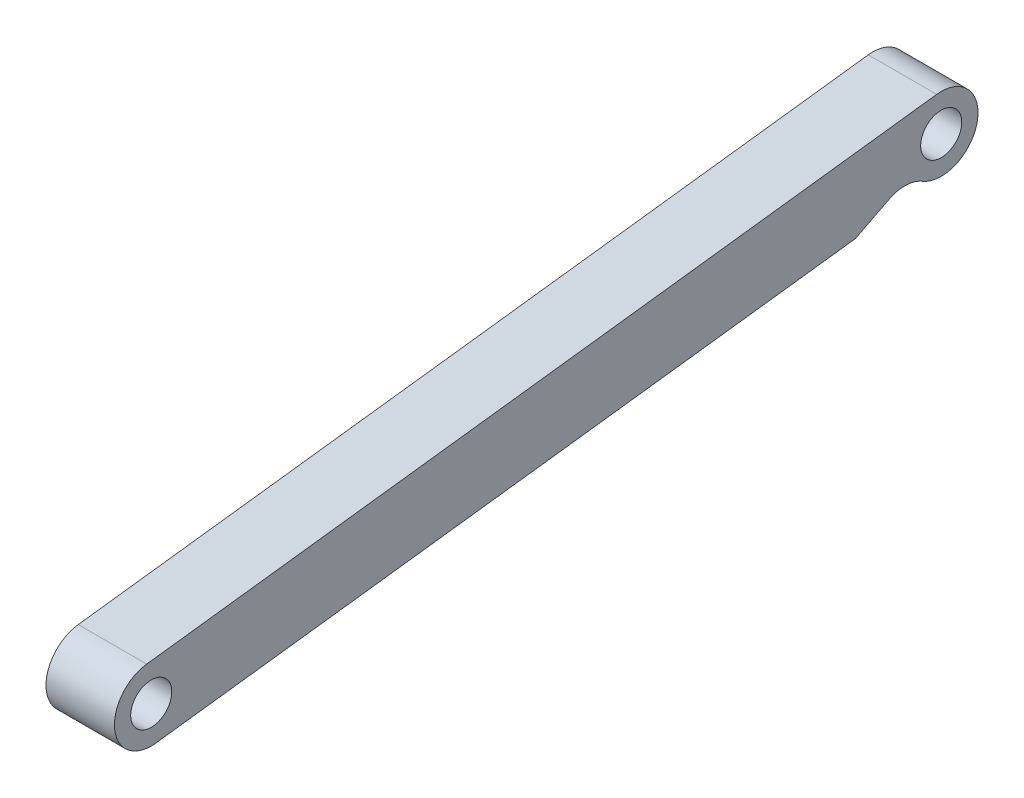
ISO-10303-21;
HEADER;
FILE_DESCRIPTION(('STEP AP214'),'2;1');
FILE_NAME('part.step','',(''),(''),'','','');
FILE_SCHEMA(('AUTOMOTIVE_DESIGN { 1 0 10303 214 1 1 1 1 }'));
ENDSEC;
DATA;
#1=APPLICATION_CONTEXT('core data for automotive mechanical design processes');
#2=APPLICATION_PROTOCOL_DEFINITION('international standard','automotive_design',2000,#1);
#3=PRODUCT_CONTEXT('',#1,'mechanical');
#4=PRODUCT('Part','Part','',(#3));
#5=PRODUCT_RELATED_PRODUCT_CATEGORY('part','',(#4));
#6=PRODUCT_DEFINITION_FORMATION('','',#4);
#7=PRODUCT_DEFINITION_CONTEXT('part definition',#1,'design');
#8=PRODUCT_DEFINITION('design','',#6,#7);
#9=PRODUCT_DEFINITION_SHAPE('','',#8);
#10=(LENGTH_UNIT() NAMED_UNIT(*) SI_UNIT(.MILLI.,.METRE.));
#11=(NAMED_UNIT(*) PLANE_ANGLE_UNIT() SI_UNIT($,.RADIAN.));
#12=(NAMED_UNIT(*) SI_UNIT($,.STERADIAN.) SOLID_ANGLE_UNIT());
#13=UNCERTAINTY_MEASURE_WITH_UNIT(LENGTH_MEASURE(1.E-05),#10,'distance_accuracy_value','');
#14=(GEOMETRIC_REPRESENTATION_CONTEXT(3) GLOBAL_UNCERTAINTY_ASSIGNED_CONTEXT((#13)) GLOBAL_UNIT_ASSIGNED_CONTEXT((#10,
#11,#12)) REPRESENTATION_CONTEXT('',''));
#15=CARTESIAN_POINT('',(0.,0.,0.));
#16=DIRECTION('',(0.,0.,1.));
#17=DIRECTION('',(1.,0.,0.));
#18=AXIS2_PLACEMENT_3D('',#15,#16,#17);
#19=CARTESIAN_POINT('',(-2.,-1.8147324714185,-44.0457999913151));
#20=DIRECTION('',(1.,0.,0.));
#21=DIRECTION('',(0.,0.,-1.));
#22=AXIS2_PLACEMENT_3D('',#19,#20,#21);
#23=CYLINDRICAL_SURFACE('',#22,2.);
#24=DIRECTION('',(1.,0.,0.));
#25=VECTOR('',#24,1.);
#26=CARTESIAN_POINT('',(-2.,-0.0967891116987391,-45.0698461879268));
#27=LINE('',#26,#25);
#28=CARTESIAN_POINT('',(-2.,-0.0967891116987391,-45.0698461879268));
#29=VERTEX_POINT('',#28);
#30=CARTESIAN_POINT('',(2.,-0.0967891116987391,-45.0698461879268));
#31=VERTEX_POINT('',#30);
#32=EDGE_CURVE('E42',#29,#31,#27,.T.);
#33=ORIENTED_EDGE('',*,*,#32,.T.);
#34=CARTESIAN_POINT('',(2.,-1.8147324714185,-44.0457999913151));
#35=DIRECTION('',(1.,0.,0.));
#36=DIRECTION('',(0.,0.,-1.));
#37=AXIS2_PLACEMENT_3D('',#34,#35,#36);
#38=CIRCLE('',#37,2.);
#39=CARTESIAN_POINT('',(2.,-0.0342900701942664,-43.1347429920429));
#40=VERTEX_POINT('',#39);
#41=EDGE_CURVE('E95',#31,#40,#38,.T.);
#42=ORIENTED_EDGE('',*,*,#41,.T.);
#43=DIRECTION('',(1.,0.,0.));
#44=VECTOR('',#43,1.);
#45=CARTESIAN_POINT('',(-2.,-0.0342900701942664,-43.1347429920429));
#46=LINE('',#45,#44);
#47=CARTESIAN_POINT('',(-2.,-0.0342900701942664,-43.1347429920429));
#48=VERTEX_POINT('',#47);
#49=EDGE_CURVE('E11',#48,#40,#46,.T.);
#50=ORIENTED_EDGE('',*,*,#49,.F.);
#51=CARTESIAN_POINT('',(-2.,-1.8147324714185,-44.0457999913151));
#52=DIRECTION('',(1.,0.,0.));
#53=DIRECTION('',(0.,0.,-1.));
#54=AXIS2_PLACEMENT_3D('',#51,#52,#53);
#55=CIRCLE('',#54,2.);
#56=EDGE_CURVE('E55',#29,#48,#55,.T.);
#57=ORIENTED_EDGE('',*,*,#56,.F.);
#58=EDGE_LOOP('',(#33,#42,#50,#57));
#59=FACE_BOUND('',#58,.T.);
#60=ADVANCED_FACE('F39',(#59),#23,.F.);
#61=CARTESIAN_POINT('',(-2.,-17.5192242955964,-8.96463255724983));
#62=DIRECTION('',(0.,-0.890221200612117,-0.455528499636106));
#63=DIRECTION('',(0.,0.455528499636106,-0.890221200612117));
#64=AXIS2_PLACEMENT_3D('',#61,#62,#63);
#65=PLANE('',#64);
#66=ORIENTED_EDGE('',*,*,#49,.T.);
#67=DIRECTION('',(0.,0.455528499636106,-0.890221200612117));
#68=VECTOR('',#67,1.);
#69=CARTESIAN_POINT('',(2.,-17.5192242955964,-8.96463255724983));
#70=LINE('',#69,#68);
#71=CARTESIAN_POINT('',(2.,-1.03929809240293,-41.1706958492843));
#72=VERTEX_POINT('',#71);
#73=EDGE_CURVE('E113',#72,#40,#70,.T.);
#74=ORIENTED_EDGE('',*,*,#73,.F.);
#75=DIRECTION('',(1.,0.,0.));
#76=VECTOR('',#75,1.);
#77=CARTESIAN_POINT('',(-2.,-1.03929809240293,-41.1706958492843));
#78=LINE('',#77,#76);
#79=CARTESIAN_POINT('',(-2.,-1.03929809240293,-41.1706958492843));
#80=VERTEX_POINT('',#79);
#81=EDGE_CURVE('E47',#80,#72,#78,.T.);
#82=ORIENTED_EDGE('',*,*,#81,.F.);
#83=DIRECTION('',(0.,0.455528499636106,-0.890221200612117));
#84=VECTOR('',#83,1.);
#85=CARTESIAN_POINT('',(-2.,-17.5192242955964,-8.96463255724983));
#86=LINE('',#85,#84);
#87=EDGE_CURVE('E139',#80,#48,#86,.T.);
#88=ORIENTED_EDGE('',*,*,#87,.T.);
#89=EDGE_LOOP('',(#66,#74,#82,#88));
#90=FACE_BOUND('',#89,.T.);
#91=ADVANCED_FACE('F163',(#90),#65,.T.);
#92=CARTESIAN_POINT('',(-2.,-6.07242734752955,-0.756247152138949));
#93=DIRECTION('',(0.,-0.992334215816846,-0.123583187040819));
#94=DIRECTION('',(0.,0.123583187040819,-0.992334215816846));
#95=AXIS2_PLACEMENT_3D('',#92,#93,#94);
#96=PLANE('',#95);
#97=ORIENTED_EDGE('',*,*,#81,.T.);
#98=DIRECTION('',(0.,0.123583187040819,-0.992334215816846));
#99=VECTOR('',#98,1.);
#100=CARTESIAN_POINT('',(2.,-6.07242734752955,-0.756247152138949));
#101=LINE('',#100,#99);
#102=CARTESIAN_POINT('',(2.,-6.13351856400622,-0.265703852137712));
#103=VERTEX_POINT('',#102);
#104=EDGE_CURVE('E120',#103,#72,#101,.T.);
#105=ORIENTED_EDGE('',*,*,#104,.F.);
#106=DIRECTION('',(1.,0.,0.));
#107=VECTOR('',#106,1.);
#108=CARTESIAN_POINT('',(-2.,-6.13351856400622,-0.265703852137712));
#109=LINE('',#108,#107);
#110=CARTESIAN_POINT('',(-2.,-6.13351856400622,-0.265703852137712));
#111=VERTEX_POINT('',#110);
#112=EDGE_CURVE('E147',#111,#103,#109,.T.);
#113=ORIENTED_EDGE('',*,*,#112,.F.);
#114=DIRECTION('',(0.,0.123583187040819,-0.992334215816846));
#115=VECTOR('',#114,1.);
#116=CARTESIAN_POINT('',(-2.,-6.07242734752955,-0.756247152138949));
#117=LINE('',#116,#115);
#118=EDGE_CURVE('E137',#111,#80,#117,.T.);
#119=ORIENTED_EDGE('',*,*,#118,.T.);
#120=EDGE_LOOP('',(#97,#105,#113,#119));
#121=FACE_BOUND('',#120,.T.);
#122=ADVANCED_FACE('F159',(#121),#96,.T.);
#123=CARTESIAN_POINT('',(-2.,-4.,0.));
#124=DIRECTION('',(1.,0.,0.));
#125=DIRECTION('',(0.,0.,-1.));
#126=AXIS2_PLACEMENT_3D('',#123,#124,#125);
#127=CYLINDRICAL_SURFACE('',#126,2.15);
#128=ORIENTED_EDGE('',*,*,#112,.T.);
#129=CARTESIAN_POINT('',(2.,-4.,0.));
#130=DIRECTION('',(1.,0.,0.));
#131=DIRECTION('',(0.,0.,-1.));
#132=AXIS2_PLACEMENT_3D('',#129,#130,#131);
#133=CIRCLE('',#132,2.15);
#134=CARTESIAN_POINT('',(2.,-1.86648143599378,0.265703852137809));
#135=VERTEX_POINT('',#134);
#136=EDGE_CURVE('E117',#135,#103,#133,.T.);
#137=ORIENTED_EDGE('',*,*,#136,.F.);
#138=DIRECTION('',(1.,0.,0.));
#139=VECTOR('',#138,1.);
#140=CARTESIAN_POINT('',(-2.,-1.86648143599378,0.265703852137809));
#141=LINE('',#140,#139);
#142=CARTESIAN_POINT('',(-2.,-1.86648143599378,0.265703852137809));
#143=VERTEX_POINT('',#142);
#144=EDGE_CURVE('E149',#143,#135,#141,.T.);
#145=ORIENTED_EDGE('',*,*,#144,.F.);
#146=CARTESIAN_POINT('',(-2.,-4.,0.));
#147=DIRECTION('',(1.,0.,0.));
#148=DIRECTION('',(0.,0.,-1.));
#149=AXIS2_PLACEMENT_3D('',#146,#147,#148);
#150=CIRCLE('',#149,2.15);
#151=EDGE_CURVE('E134',#143,#111,#150,.T.);
#152=ORIENTED_EDGE('',*,*,#151,.T.);
#153=EDGE_LOOP('',(#128,#137,#145,#152));
#154=FACE_BOUND('',#153,.T.);
#155=ADVANCED_FACE('F156',(#154),#127,.T.);
#156=CARTESIAN_POINT('',(-2.,-1.80539021951711,-0.224839447863429));
#157=DIRECTION('',(0.,-0.992334215816846,-0.123583187040819));
#158=DIRECTION('',(0.,0.123583187040819,-0.992334215816846));
#159=AXIS2_PLACEMENT_3D('',#156,#157,#158);
#160=PLANE('',#159);
#161=ORIENTED_EDGE('',*,*,#144,.T.);
#162=DIRECTION('',(0.,0.123583187040819,-0.992334215816846));
#163=VECTOR('',#162,1.);
#164=CARTESIAN_POINT('',(2.,-1.80539021951711,-0.224839447863429));
#165=LINE('',#164,#163);
#166=CARTESIAN_POINT('',(2.,3.88351856400622,-45.9049919971466));
#167=VERTEX_POINT('',#166);
#168=EDGE_CURVE('E107',#135,#167,#165,.T.);
#169=ORIENTED_EDGE('',*,*,#168,.T.);
#170=DIRECTION('',(1.,0.,0.));
#171=VECTOR('',#170,1.);
#172=CARTESIAN_POINT('',(-2.,3.88351856400622,-45.9049919971466));
#173=LINE('',#172,#171);
#174=CARTESIAN_POINT('',(-2.,3.88351856400622,-45.9049919971466));
#175=VERTEX_POINT('',#174);
#176=EDGE_CURVE('E98',#175,#167,#173,.T.);
#177=ORIENTED_EDGE('',*,*,#176,.F.);
#178=DIRECTION('',(0.,0.123583187040819,-0.992334215816846));
#179=VECTOR('',#178,1.);
#180=CARTESIAN_POINT('',(-2.,-1.80539021951711,-0.224839447863429));
#181=LINE('',#180,#179);
#182=EDGE_CURVE('E132',#143,#175,#181,.T.);
#183=ORIENTED_EDGE('',*,*,#182,.F.);
#184=EDGE_LOOP('',(#161,#169,#177,#183));
#185=FACE_BOUND('',#184,.T.);
#186=ADVANCED_FACE('F153',(#185),#160,.F.);
#187=CARTESIAN_POINT('',(-2.,1.75,-46.1706958492843));
#188=DIRECTION('',(1.,0.,0.));
#189=DIRECTION('',(0.,0.,-1.));
#190=AXIS2_PLACEMENT_3D('',#187,#188,#189);
#191=CYLINDRICAL_SURFACE('',#190,1.2);
#192=CARTESIAN_POINT('',(-2.,1.75,-46.1706958492843));
#193=DIRECTION('',(1.,0.,0.));
#194=DIRECTION('',(0.,0.,-1.));
#195=AXIS2_PLACEMENT_3D('',#192,#193,#194);
#196=CIRCLE('',#195,1.2);
#197=CARTESIAN_POINT('',(-2.,1.75,-47.3706958492843));
#198=VERTEX_POINT('',#197);
#199=EDGE_CURVE('E141',#198,#198,#196,.T.);
#200=ORIENTED_EDGE('',*,*,#199,.F.);
#201=EDGE_LOOP('',(#200));
#202=FACE_BOUND('',#201,.T.);
#203=CARTESIAN_POINT('',(2.,1.75,-46.1706958492843));
#204=DIRECTION('',(1.,0.,0.));
#205=DIRECTION('',(0.,0.,-1.));
#206=AXIS2_PLACEMENT_3D('',#203,#204,#205);
#207=CIRCLE('',#206,1.2);
#208=CARTESIAN_POINT('',(2.,1.75,-47.3706958492843));
#209=VERTEX_POINT('',#208);
#210=EDGE_CURVE('E123',#209,#209,#207,.T.);
#211=ORIENTED_EDGE('',*,*,#210,.T.);
#212=EDGE_LOOP('',(#211));
#213=FACE_BOUND('',#212,.T.);
#214=ADVANCED_FACE('F172',(#202,#213),#191,.F.);
#215=CARTESIAN_POINT('',(-2.,1.75,-46.1706958492843));
#216=DIRECTION('',(1.,0.,0.));
#217=DIRECTION('',(0.,0.,-1.));
#218=AXIS2_PLACEMENT_3D('',#215,#216,#217);
#219=CYLINDRICAL_SURFACE('',#218,2.15);
#220=ORIENTED_EDGE('',*,*,#176,.T.);
#221=CARTESIAN_POINT('',(2.,1.75,-46.1706958492843));
#222=DIRECTION('',(1.,0.,0.));
#223=DIRECTION('',(0.,0.,-1.));
#224=AXIS2_PLACEMENT_3D('',#221,#222,#223);
#225=CIRCLE('',#224,2.15);
#226=EDGE_CURVE('E101',#31,#167,#225,.T.);
#227=ORIENTED_EDGE('',*,*,#226,.F.);
#228=ORIENTED_EDGE('',*,*,#32,.F.);
#229=CARTESIAN_POINT('',(-2.,1.75,-46.1706958492843));
#230=DIRECTION('',(1.,0.,0.));
#231=DIRECTION('',(0.,0.,-1.));
#232=AXIS2_PLACEMENT_3D('',#229,#230,#231);
#233=CIRCLE('',#232,2.15);
#234=EDGE_CURVE('E130',#29,#175,#233,.T.);
#235=ORIENTED_EDGE('',*,*,#234,.T.);
#236=EDGE_LOOP('',(#220,#227,#228,#235));
#237=FACE_BOUND('',#236,.T.);
#238=ADVANCED_FACE('F102',(#237),#219,.T.);
#239=CARTESIAN_POINT('',(-2.,-4.,0.));
#240=DIRECTION('',(1.,0.,0.));
#241=DIRECTION('',(0.,0.,-1.));
#242=AXIS2_PLACEMENT_3D('',#239,#240,#241);
#243=CYLINDRICAL_SURFACE('',#242,1.2);
#244=CARTESIAN_POINT('',(-2.,-4.,0.));
#245=DIRECTION('',(1.,0.,0.));
#246=DIRECTION('',(0.,0.,-1.));
#247=AXIS2_PLACEMENT_3D('',#244,#245,#246);
#248=CIRCLE('',#247,1.2);
#249=CARTESIAN_POINT('',(-2.,-4.,-1.19999999999995));
#250=VERTEX_POINT('',#249);
#251=EDGE_CURVE('E99',#250,#250,#248,.T.);
#252=ORIENTED_EDGE('',*,*,#251,.F.);
#253=EDGE_LOOP('',(#252));
#254=FACE_BOUND('',#253,.T.);
#255=CARTESIAN_POINT('',(2.,-4.,0.));
#256=DIRECTION('',(1.,0.,0.));
#257=DIRECTION('',(0.,0.,-1.));
#258=AXIS2_PLACEMENT_3D('',#255,#256,#257);
#259=CIRCLE('',#258,1.2);
#260=CARTESIAN_POINT('',(2.,-4.,-1.19999999999995));
#261=VERTEX_POINT('',#260);
#262=EDGE_CURVE('E126',#261,#261,#259,.T.);
#263=ORIENTED_EDGE('',*,*,#262,.T.);
#264=EDGE_LOOP('',(#263));
#265=FACE_BOUND('',#264,.T.);
#266=ADVANCED_FACE('F179',(#254,#265),#243,.F.);
#267=CARTESIAN_POINT('',(-2.,0.,0.));
#268=DIRECTION('',(1.,0.,0.));
#269=DIRECTION('',(0.,0.,-1.));
#270=AXIS2_PLACEMENT_3D('',#267,#268,#269);
#271=PLANE('',#270);
#272=ORIENTED_EDGE('',*,*,#56,.T.);
#273=ORIENTED_EDGE('',*,*,#87,.F.);
#274=ORIENTED_EDGE('',*,*,#118,.F.);
#275=ORIENTED_EDGE('',*,*,#151,.F.);
#276=ORIENTED_EDGE('',*,*,#182,.T.);
#277=ORIENTED_EDGE('',*,*,#234,.F.);
#278=EDGE_LOOP('',(#272,#273,#274,#275,#276,#277));
#279=FACE_BOUND('',#278,.T.);
#280=ORIENTED_EDGE('',*,*,#199,.T.);
#281=EDGE_LOOP('',(#280));
#282=FACE_BOUND('',#281,.T.);
#283=ORIENTED_EDGE('',*,*,#251,.T.);
#284=EDGE_LOOP('',(#283));
#285=FACE_BOUND('',#284,.T.);
#286=ADVANCED_FACE('F161',(#279,#282,#285),#271,.F.);
#287=CARTESIAN_POINT('',(2.,0.,0.));
#288=DIRECTION('',(1.,0.,0.));
#289=DIRECTION('',(0.,0.,-1.));
#290=AXIS2_PLACEMENT_3D('',#287,#288,#289);
#291=PLANE('',#290);
#292=ORIENTED_EDGE('',*,*,#41,.F.);
#293=ORIENTED_EDGE('',*,*,#226,.T.);
#294=ORIENTED_EDGE('',*,*,#168,.F.);
#295=ORIENTED_EDGE('',*,*,#136,.T.);
#296=ORIENTED_EDGE('',*,*,#104,.T.);
#297=ORIENTED_EDGE('',*,*,#73,.T.);
#298=EDGE_LOOP('',(#292,#293,#294,#295,#296,#297));
#299=FACE_BOUND('',#298,.T.);
#300=ORIENTED_EDGE('',*,*,#210,.F.);
#301=EDGE_LOOP('',(#300));
#302=FACE_BOUND('',#301,.T.);
#303=ORIENTED_EDGE('',*,*,#262,.F.);
#304=EDGE_LOOP('',(#303));
#305=FACE_BOUND('',#304,.T.);
#306=ADVANCED_FACE('F110',(#299,#302,#305),#291,.T.);
#307=CLOSED_SHELL('',(#60,#91,#122,#155,#186,#214,#238,#266,#286,#306));
#308=MANIFOLD_SOLID_BREP('B2',#307);
#309=ADVANCED_BREP_SHAPE_REPRESENTATION('',(#18,#308),#14);
#310=SHAPE_DEFINITION_REPRESENTATION(#9,#309);
ENDSEC;
END-ISO-10303-21;
